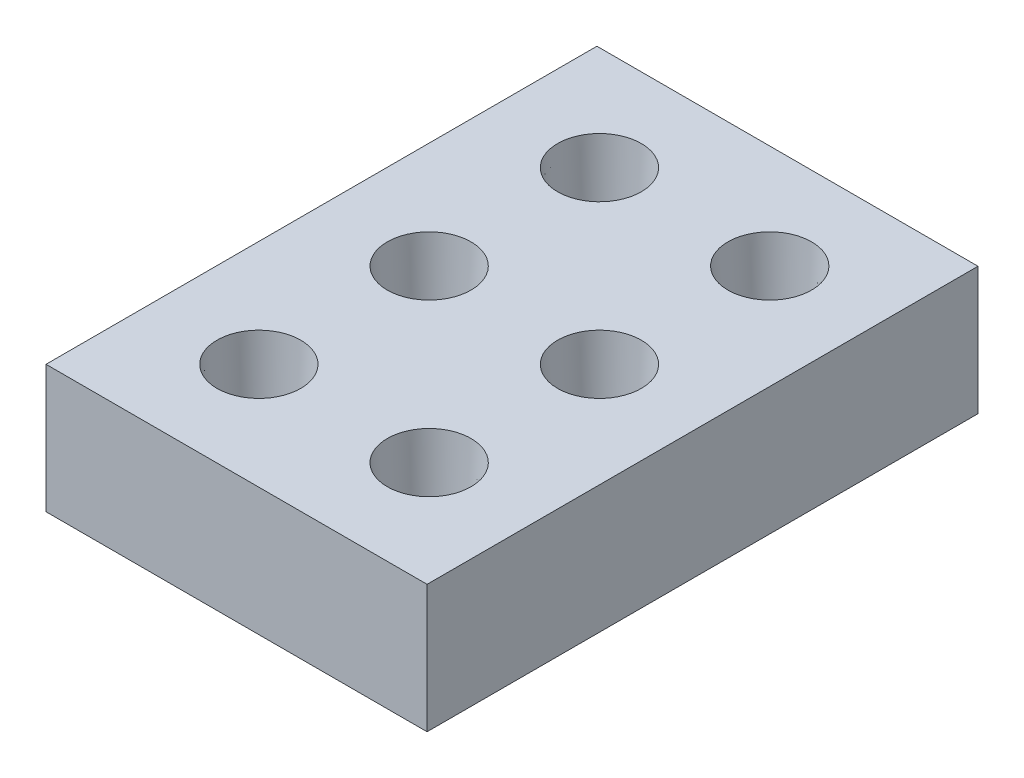
ISO-10303-21;
HEADER;
FILE_DESCRIPTION(('STEP AP214'),'2;1');
FILE_NAME('part.step','',(''),(''),'','','');
FILE_SCHEMA(('AUTOMOTIVE_DESIGN { 1 0 10303 214 1 1 1 1 }'));
ENDSEC;
DATA;
#1=APPLICATION_CONTEXT('core data for automotive mechanical design processes');
#2=APPLICATION_PROTOCOL_DEFINITION('international standard','automotive_design',2000,#1);
#3=PRODUCT_CONTEXT('',#1,'mechanical');
#4=PRODUCT('Part','Part','',(#3));
#5=PRODUCT_RELATED_PRODUCT_CATEGORY('part','',(#4));
#6=PRODUCT_DEFINITION_FORMATION('','',#4);
#7=PRODUCT_DEFINITION_CONTEXT('part definition',#1,'design');
#8=PRODUCT_DEFINITION('design','',#6,#7);
#9=PRODUCT_DEFINITION_SHAPE('','',#8);
#10=(LENGTH_UNIT() NAMED_UNIT(*) SI_UNIT(.MILLI.,.METRE.));
#11=(NAMED_UNIT(*) PLANE_ANGLE_UNIT() SI_UNIT($,.RADIAN.));
#12=(NAMED_UNIT(*) SI_UNIT($,.STERADIAN.) SOLID_ANGLE_UNIT());
#13=UNCERTAINTY_MEASURE_WITH_UNIT(LENGTH_MEASURE(1.E-05),#10,'distance_accuracy_value','');
#14=(GEOMETRIC_REPRESENTATION_CONTEXT(3) GLOBAL_UNCERTAINTY_ASSIGNED_CONTEXT((#13)) GLOBAL_UNIT_ASSIGNED_CONTEXT((#10,
#11,#12)) REPRESENTATION_CONTEXT('',''));
#15=CARTESIAN_POINT('',(0.,0.,0.));
#16=DIRECTION('',(0.,0.,1.));
#17=DIRECTION('',(1.,0.,0.));
#18=AXIS2_PLACEMENT_3D('',#15,#16,#17);
#19=CARTESIAN_POINT('',(-5.,6.,0.));
#20=DIRECTION('',(1.,0.,0.));
#21=DIRECTION('',(0.,0.,-1.));
#22=AXIS2_PLACEMENT_3D('',#19,#20,#21);
#23=PLANE('',#22);
#24=DIRECTION('',(0.,0.,1.));
#25=VECTOR('',#24,1.);
#26=CARTESIAN_POINT('',(-5.,0.,0.));
#27=LINE('',#26,#25);
#28=CARTESIAN_POINT('',(-5.,0.,-25.8806045787026));
#29=VERTEX_POINT('',#28);
#30=CARTESIAN_POINT('',(-5.,0.,0.));
#31=VERTEX_POINT('',#30);
#32=EDGE_CURVE('E107',#29,#31,#27,.T.);
#33=ORIENTED_EDGE('',*,*,#32,.T.);
#34=DIRECTION('',(0.,-1.,0.));
#35=VECTOR('',#34,1.);
#36=CARTESIAN_POINT('',(-5.,6.,0.));
#37=LINE('',#36,#35);
#38=CARTESIAN_POINT('',(-5.,6.,0.));
#39=VERTEX_POINT('',#38);
#40=EDGE_CURVE('E11',#39,#31,#37,.T.);
#41=ORIENTED_EDGE('',*,*,#40,.F.);
#42=DIRECTION('',(0.,0.,1.));
#43=VECTOR('',#42,1.);
#44=CARTESIAN_POINT('',(-5.,6.,0.));
#45=LINE('',#44,#43);
#46=CARTESIAN_POINT('',(-5.,6.,-25.8806045787026));
#47=VERTEX_POINT('',#46);
#48=EDGE_CURVE('E91',#47,#39,#45,.T.);
#49=ORIENTED_EDGE('',*,*,#48,.F.);
#50=DIRECTION('',(0.,-1.,0.));
#51=VECTOR('',#50,1.);
#52=CARTESIAN_POINT('',(-5.,6.,-25.8806045787026));
#53=LINE('',#52,#51);
#54=EDGE_CURVE('E103',#47,#29,#53,.T.);
#55=ORIENTED_EDGE('',*,*,#54,.T.);
#56=EDGE_LOOP('',(#33,#41,#49,#55));
#57=FACE_BOUND('',#56,.T.);
#58=ADVANCED_FACE('F39',(#57),#23,.F.);
#59=CARTESIAN_POINT('',(-5.,6.,0.));
#60=DIRECTION('',(0.,0.,-1.));
#61=DIRECTION('',(-1.,0.,0.));
#62=AXIS2_PLACEMENT_3D('',#59,#60,#61);
#63=PLANE('',#62);
#64=DIRECTION('',(1.,0.,0.));
#65=VECTOR('',#64,1.);
#66=CARTESIAN_POINT('',(-5.,0.,0.));
#67=LINE('',#66,#65);
#68=CARTESIAN_POINT('',(12.90242071817,0.,0.));
#69=VERTEX_POINT('',#68);
#70=EDGE_CURVE('E96',#31,#69,#67,.T.);
#71=ORIENTED_EDGE('',*,*,#70,.T.);
#72=DIRECTION('',(0.,-1.,0.));
#73=VECTOR('',#72,1.);
#74=CARTESIAN_POINT('',(12.90242071817,6.,0.));
#75=LINE('',#74,#73);
#76=CARTESIAN_POINT('',(12.90242071817,6.,0.));
#77=VERTEX_POINT('',#76);
#78=EDGE_CURVE('E48',#77,#69,#75,.T.);
#79=ORIENTED_EDGE('',*,*,#78,.F.);
#80=DIRECTION('',(1.,0.,0.));
#81=VECTOR('',#80,1.);
#82=CARTESIAN_POINT('',(-5.,6.,0.));
#83=LINE('',#82,#81);
#84=EDGE_CURVE('E86',#39,#77,#83,.T.);
#85=ORIENTED_EDGE('',*,*,#84,.F.);
#86=ORIENTED_EDGE('',*,*,#40,.T.);
#87=EDGE_LOOP('',(#71,#79,#85,#86));
#88=FACE_BOUND('',#87,.T.);
#89=ADVANCED_FACE('F95',(#88),#63,.F.);
#90=CARTESIAN_POINT('',(12.90242071817,6.,0.));
#91=DIRECTION('',(-1.,0.,0.));
#92=DIRECTION('',(0.,0.,1.));
#93=AXIS2_PLACEMENT_3D('',#90,#91,#92);
#94=PLANE('',#93);
#95=DIRECTION('',(0.,0.,-1.));
#96=VECTOR('',#95,1.);
#97=CARTESIAN_POINT('',(12.90242071817,0.,0.));
#98=LINE('',#97,#96);
#99=CARTESIAN_POINT('',(12.90242071817,0.,-25.8806045787026));
#100=VERTEX_POINT('',#99);
#101=EDGE_CURVE('E73',#69,#100,#98,.T.);
#102=ORIENTED_EDGE('',*,*,#101,.T.);
#103=DIRECTION('',(0.,-1.,0.));
#104=VECTOR('',#103,1.);
#105=CARTESIAN_POINT('',(12.90242071817,6.,-25.8806045787026));
#106=LINE('',#105,#104);
#107=CARTESIAN_POINT('',(12.90242071817,6.,-25.8806045787026));
#108=VERTEX_POINT('',#107);
#109=EDGE_CURVE('E98',#108,#100,#106,.T.);
#110=ORIENTED_EDGE('',*,*,#109,.F.);
#111=DIRECTION('',(0.,0.,-1.));
#112=VECTOR('',#111,1.);
#113=CARTESIAN_POINT('',(12.90242071817,6.,0.));
#114=LINE('',#113,#112);
#115=EDGE_CURVE('E89',#77,#108,#114,.T.);
#116=ORIENTED_EDGE('',*,*,#115,.F.);
#117=ORIENTED_EDGE('',*,*,#78,.T.);
#118=EDGE_LOOP('',(#102,#110,#116,#117));
#119=FACE_BOUND('',#118,.T.);
#120=ADVANCED_FACE('F99',(#119),#94,.F.);
#121=CARTESIAN_POINT('',(-5.,6.,-25.8806045787026));
#122=DIRECTION('',(0.,0.,1.));
#123=DIRECTION('',(1.,0.,0.));
#124=AXIS2_PLACEMENT_3D('',#121,#122,#123);
#125=PLANE('',#124);
#126=DIRECTION('',(-1.,0.,0.));
#127=VECTOR('',#126,1.);
#128=CARTESIAN_POINT('',(-5.,0.,-25.8806045787026));
#129=LINE('',#128,#127);
#130=EDGE_CURVE('E79',#100,#29,#129,.T.);
#131=ORIENTED_EDGE('',*,*,#130,.T.);
#132=ORIENTED_EDGE('',*,*,#54,.F.);
#133=DIRECTION('',(-1.,0.,0.));
#134=VECTOR('',#133,1.);
#135=CARTESIAN_POINT('',(-5.,6.,-25.8806045787026));
#136=LINE('',#135,#134);
#137=EDGE_CURVE('E56',#108,#47,#136,.T.);
#138=ORIENTED_EDGE('',*,*,#137,.F.);
#139=ORIENTED_EDGE('',*,*,#109,.T.);
#140=EDGE_LOOP('',(#131,#132,#138,#139));
#141=FACE_BOUND('',#140,.T.);
#142=ADVANCED_FACE('F121',(#141),#125,.F.);
#143=CARTESIAN_POINT('',(0.,6.,0.));
#144=DIRECTION('',(0.,-1.,0.));
#145=DIRECTION('',(0.,0.,-1.));
#146=AXIS2_PLACEMENT_3D('',#143,#144,#145);
#147=PLANE('',#146);
#148=CARTESIAN_POINT('',(8.,6.,-21.));
#149=DIRECTION('',(0.,1.,0.));
#150=DIRECTION('',(0.,0.,1.));
#151=AXIS2_PLACEMENT_3D('',#148,#149,#150);
#152=CIRCLE('',#151,1.96579507344183);
#153=CARTESIAN_POINT('',(8.,6.,-19.0342049265582));
#154=VERTEX_POINT('',#153);
#155=EDGE_CURVE('E195',#154,#154,#152,.T.);
#156=ORIENTED_EDGE('',*,*,#155,.F.);
#157=EDGE_LOOP('',(#156));
#158=FACE_BOUND('',#157,.T.);
#159=CARTESIAN_POINT('',(0.,6.,-21.));
#160=DIRECTION('',(0.,1.,0.));
#161=DIRECTION('',(0.,0.,1.));
#162=AXIS2_PLACEMENT_3D('',#159,#160,#161);
#163=CIRCLE('',#162,1.96579507344183);
#164=CARTESIAN_POINT('',(0.,6.,-19.0342049265582));
#165=VERTEX_POINT('',#164);
#166=EDGE_CURVE('E183',#165,#165,#163,.T.);
#167=ORIENTED_EDGE('',*,*,#166,.F.);
#168=EDGE_LOOP('',(#167));
#169=FACE_BOUND('',#168,.T.);
#170=CARTESIAN_POINT('',(8.,6.,-13.));
#171=DIRECTION('',(0.,1.,0.));
#172=DIRECTION('',(0.,0.,1.));
#173=AXIS2_PLACEMENT_3D('',#170,#171,#172);
#174=CIRCLE('',#173,1.96579507344183);
#175=CARTESIAN_POINT('',(8.,6.,-11.0342049265582));
#176=VERTEX_POINT('',#175);
#177=EDGE_CURVE('E171',#176,#176,#174,.T.);
#178=ORIENTED_EDGE('',*,*,#177,.F.);
#179=EDGE_LOOP('',(#178));
#180=FACE_BOUND('',#179,.T.);
#181=CARTESIAN_POINT('',(0.,6.,-13.));
#182=DIRECTION('',(0.,1.,0.));
#183=DIRECTION('',(0.,0.,1.));
#184=AXIS2_PLACEMENT_3D('',#181,#182,#183);
#185=CIRCLE('',#184,1.96579507344183);
#186=CARTESIAN_POINT('',(0.,6.,-11.0342049265582));
#187=VERTEX_POINT('',#186);
#188=EDGE_CURVE('E159',#187,#187,#185,.T.);
#189=ORIENTED_EDGE('',*,*,#188,.F.);
#190=EDGE_LOOP('',(#189));
#191=FACE_BOUND('',#190,.T.);
#192=CARTESIAN_POINT('',(8.,6.,-5.));
#193=DIRECTION('',(0.,1.,0.));
#194=DIRECTION('',(0.,0.,1.));
#195=AXIS2_PLACEMENT_3D('',#192,#193,#194);
#196=CIRCLE('',#195,1.96579507344183);
#197=CARTESIAN_POINT('',(8.,6.,-3.03420492655817));
#198=VERTEX_POINT('',#197);
#199=EDGE_CURVE('E147',#198,#198,#196,.T.);
#200=ORIENTED_EDGE('',*,*,#199,.F.);
#201=EDGE_LOOP('',(#200));
#202=FACE_BOUND('',#201,.T.);
#203=CARTESIAN_POINT('',(0.,6.,-5.));
#204=DIRECTION('',(0.,1.,0.));
#205=DIRECTION('',(0.,0.,1.));
#206=AXIS2_PLACEMENT_3D('',#203,#204,#205);
#207=CIRCLE('',#206,1.96579507344183);
#208=CARTESIAN_POINT('',(0.,6.,-3.03420492655817));
#209=VERTEX_POINT('',#208);
#210=EDGE_CURVE('E135',#209,#209,#207,.T.);
#211=ORIENTED_EDGE('',*,*,#210,.F.);
#212=EDGE_LOOP('',(#211));
#213=FACE_BOUND('',#212,.T.);
#214=ORIENTED_EDGE('',*,*,#48,.T.);
#215=ORIENTED_EDGE('',*,*,#84,.T.);
#216=ORIENTED_EDGE('',*,*,#115,.T.);
#217=ORIENTED_EDGE('',*,*,#137,.T.);
#218=EDGE_LOOP('',(#214,#215,#216,#217));
#219=FACE_BOUND('',#218,.T.);
#220=ADVANCED_FACE('F87',(#158,#169,#180,#191,#202,#213,#219),#147,.F.);
#221=CARTESIAN_POINT('',(0.,0.,0.));
#222=DIRECTION('',(0.,-1.,0.));
#223=DIRECTION('',(0.,0.,-1.));
#224=AXIS2_PLACEMENT_3D('',#221,#222,#223);
#225=PLANE('',#224);
#226=CARTESIAN_POINT('',(8.,0.,-21.));
#227=DIRECTION('',(0.,1.,0.));
#228=DIRECTION('',(0.,0.,1.));
#229=AXIS2_PLACEMENT_3D('',#226,#227,#228);
#230=CIRCLE('',#229,1.77);
#231=CARTESIAN_POINT('',(8.,0.,-19.23));
#232=VERTEX_POINT('',#231);
#233=EDGE_CURVE('E187',#232,#232,#230,.T.);
#234=ORIENTED_EDGE('',*,*,#233,.T.);
#235=EDGE_LOOP('',(#234));
#236=FACE_BOUND('',#235,.T.);
#237=CARTESIAN_POINT('',(0.,0.,-21.));
#238=DIRECTION('',(0.,1.,0.));
#239=DIRECTION('',(0.,0.,1.));
#240=AXIS2_PLACEMENT_3D('',#237,#238,#239);
#241=CIRCLE('',#240,1.77);
#242=CARTESIAN_POINT('',(0.,0.,-19.23));
#243=VERTEX_POINT('',#242);
#244=EDGE_CURVE('E175',#243,#243,#241,.T.);
#245=ORIENTED_EDGE('',*,*,#244,.T.);
#246=EDGE_LOOP('',(#245));
#247=FACE_BOUND('',#246,.T.);
#248=CARTESIAN_POINT('',(8.,0.,-13.));
#249=DIRECTION('',(0.,1.,0.));
#250=DIRECTION('',(0.,0.,1.));
#251=AXIS2_PLACEMENT_3D('',#248,#249,#250);
#252=CIRCLE('',#251,1.77);
#253=CARTESIAN_POINT('',(8.,0.,-11.23));
#254=VERTEX_POINT('',#253);
#255=EDGE_CURVE('E163',#254,#254,#252,.T.);
#256=ORIENTED_EDGE('',*,*,#255,.T.);
#257=EDGE_LOOP('',(#256));
#258=FACE_BOUND('',#257,.T.);
#259=CARTESIAN_POINT('',(0.,0.,-13.));
#260=DIRECTION('',(0.,1.,0.));
#261=DIRECTION('',(0.,0.,1.));
#262=AXIS2_PLACEMENT_3D('',#259,#260,#261);
#263=CIRCLE('',#262,1.77);
#264=CARTESIAN_POINT('',(0.,0.,-11.23));
#265=VERTEX_POINT('',#264);
#266=EDGE_CURVE('E151',#265,#265,#263,.T.);
#267=ORIENTED_EDGE('',*,*,#266,.T.);
#268=EDGE_LOOP('',(#267));
#269=FACE_BOUND('',#268,.T.);
#270=CARTESIAN_POINT('',(8.,0.,-5.));
#271=DIRECTION('',(0.,1.,0.));
#272=DIRECTION('',(0.,0.,1.));
#273=AXIS2_PLACEMENT_3D('',#270,#271,#272);
#274=CIRCLE('',#273,1.77);
#275=CARTESIAN_POINT('',(8.,0.,-3.23));
#276=VERTEX_POINT('',#275);
#277=EDGE_CURVE('E139',#276,#276,#274,.T.);
#278=ORIENTED_EDGE('',*,*,#277,.T.);
#279=EDGE_LOOP('',(#278));
#280=FACE_BOUND('',#279,.T.);
#281=CARTESIAN_POINT('',(0.,0.,-5.));
#282=DIRECTION('',(0.,1.,0.));
#283=DIRECTION('',(0.,0.,1.));
#284=AXIS2_PLACEMENT_3D('',#281,#282,#283);
#285=CIRCLE('',#284,1.77);
#286=CARTESIAN_POINT('',(0.,0.,-3.23));
#287=VERTEX_POINT('',#286);
#288=EDGE_CURVE('E111',#287,#287,#285,.T.);
#289=ORIENTED_EDGE('',*,*,#288,.T.);
#290=EDGE_LOOP('',(#289));
#291=FACE_BOUND('',#290,.T.);
#292=ORIENTED_EDGE('',*,*,#32,.F.);
#293=ORIENTED_EDGE('',*,*,#130,.F.);
#294=ORIENTED_EDGE('',*,*,#101,.F.);
#295=ORIENTED_EDGE('',*,*,#70,.F.);
#296=EDGE_LOOP('',(#292,#293,#294,#295));
#297=FACE_BOUND('',#296,.T.);
#298=ADVANCED_FACE('F124',(#236,#247,#258,#269,#280,#291,#297),#225,.T.);
#299=CARTESIAN_POINT('',(0.,6.,-5.));
#300=DIRECTION('',(0.,1.,0.));
#301=DIRECTION('',(0.,0.,1.));
#302=AXIS2_PLACEMENT_3D('',#299,#300,#301);
#303=CYLINDRICAL_SURFACE('',#302,1.77);
#304=ORIENTED_EDGE('',*,*,#288,.F.);
#305=EDGE_LOOP('',(#304));
#306=FACE_BOUND('',#305,.T.);
#307=CARTESIAN_POINT('',(0.,3.2,-5.));
#308=DIRECTION('',(0.,1.,0.));
#309=DIRECTION('',(0.,0.,1.));
#310=AXIS2_PLACEMENT_3D('',#307,#308,#309);
#311=CIRCLE('',#310,1.77);
#312=CARTESIAN_POINT('',(0.,3.2,-3.23));
#313=VERTEX_POINT('',#312);
#314=EDGE_CURVE('E131',#313,#313,#311,.T.);
#315=ORIENTED_EDGE('',*,*,#314,.T.);
#316=EDGE_LOOP('',(#315));
#317=FACE_BOUND('',#316,.T.);
#318=ADVANCED_FACE('F218',(#306,#317),#303,.F.);
#319=CARTESIAN_POINT('',(0.,6.,-5.));
#320=DIRECTION('',(0.,1.,0.));
#321=DIRECTION('',(0.,0.,1.));
#322=AXIS2_PLACEMENT_3D('',#319,#320,#321);
#323=CONICAL_SURFACE('',#322,1.96579507344183,0.0698131700797732);
#324=ORIENTED_EDGE('',*,*,#314,.F.);
#325=EDGE_LOOP('',(#324));
#326=FACE_BOUND('',#325,.T.);
#327=ORIENTED_EDGE('',*,*,#210,.T.);
#328=EDGE_LOOP('',(#327));
#329=FACE_BOUND('',#328,.T.);
#330=ADVANCED_FACE('F215',(#326,#329),#323,.F.);
#331=CARTESIAN_POINT('',(8.,6.,-5.));
#332=DIRECTION('',(0.,1.,0.));
#333=DIRECTION('',(0.,0.,1.));
#334=AXIS2_PLACEMENT_3D('',#331,#332,#333);
#335=CYLINDRICAL_SURFACE('',#334,1.77);
#336=ORIENTED_EDGE('',*,*,#277,.F.);
#337=EDGE_LOOP('',(#336));
#338=FACE_BOUND('',#337,.T.);
#339=CARTESIAN_POINT('',(8.,3.2,-5.));
#340=DIRECTION('',(0.,1.,0.));
#341=DIRECTION('',(0.,0.,1.));
#342=AXIS2_PLACEMENT_3D('',#339,#340,#341);
#343=CIRCLE('',#342,1.77);
#344=CARTESIAN_POINT('',(8.,3.2,-3.23));
#345=VERTEX_POINT('',#344);
#346=EDGE_CURVE('E143',#345,#345,#343,.T.);
#347=ORIENTED_EDGE('',*,*,#346,.T.);
#348=EDGE_LOOP('',(#347));
#349=FACE_BOUND('',#348,.T.);
#350=ADVANCED_FACE('F217',(#338,#349),#335,.F.);
#351=CARTESIAN_POINT('',(8.,6.,-5.));
#352=DIRECTION('',(0.,1.,0.));
#353=DIRECTION('',(0.,0.,1.));
#354=AXIS2_PLACEMENT_3D('',#351,#352,#353);
#355=CONICAL_SURFACE('',#354,1.96579507344183,0.0698131700797732);
#356=ORIENTED_EDGE('',*,*,#346,.F.);
#357=EDGE_LOOP('',(#356));
#358=FACE_BOUND('',#357,.T.);
#359=ORIENTED_EDGE('',*,*,#199,.T.);
#360=EDGE_LOOP('',(#359));
#361=FACE_BOUND('',#360,.T.);
#362=ADVANCED_FACE('F225',(#358,#361),#355,.F.);
#363=CARTESIAN_POINT('',(0.,6.,-13.));
#364=DIRECTION('',(0.,1.,0.));
#365=DIRECTION('',(0.,0.,1.));
#366=AXIS2_PLACEMENT_3D('',#363,#364,#365);
#367=CYLINDRICAL_SURFACE('',#366,1.77);
#368=ORIENTED_EDGE('',*,*,#266,.F.);
#369=EDGE_LOOP('',(#368));
#370=FACE_BOUND('',#369,.T.);
#371=CARTESIAN_POINT('',(0.,3.2,-13.));
#372=DIRECTION('',(0.,1.,0.));
#373=DIRECTION('',(0.,0.,1.));
#374=AXIS2_PLACEMENT_3D('',#371,#372,#373);
#375=CIRCLE('',#374,1.77);
#376=CARTESIAN_POINT('',(0.,3.2,-11.23));
#377=VERTEX_POINT('',#376);
#378=EDGE_CURVE('E155',#377,#377,#375,.T.);
#379=ORIENTED_EDGE('',*,*,#378,.T.);
#380=EDGE_LOOP('',(#379));
#381=FACE_BOUND('',#380,.T.);
#382=ADVANCED_FACE('F263',(#370,#381),#367,.F.);
#383=CARTESIAN_POINT('',(0.,6.,-13.));
#384=DIRECTION('',(0.,1.,0.));
#385=DIRECTION('',(0.,0.,1.));
#386=AXIS2_PLACEMENT_3D('',#383,#384,#385);
#387=CONICAL_SURFACE('',#386,1.96579507344183,0.0698131700797732);
#388=ORIENTED_EDGE('',*,*,#378,.F.);
#389=EDGE_LOOP('',(#388));
#390=FACE_BOUND('',#389,.T.);
#391=ORIENTED_EDGE('',*,*,#188,.T.);
#392=EDGE_LOOP('',(#391));
#393=FACE_BOUND('',#392,.T.);
#394=ADVANCED_FACE('F268',(#390,#393),#387,.F.);
#395=CARTESIAN_POINT('',(8.,6.,-13.));
#396=DIRECTION('',(0.,1.,0.));
#397=DIRECTION('',(0.,0.,1.));
#398=AXIS2_PLACEMENT_3D('',#395,#396,#397);
#399=CYLINDRICAL_SURFACE('',#398,1.77);
#400=ORIENTED_EDGE('',*,*,#255,.F.);
#401=EDGE_LOOP('',(#400));
#402=FACE_BOUND('',#401,.T.);
#403=CARTESIAN_POINT('',(8.,3.2,-13.));
#404=DIRECTION('',(0.,1.,0.));
#405=DIRECTION('',(0.,0.,1.));
#406=AXIS2_PLACEMENT_3D('',#403,#404,#405);
#407=CIRCLE('',#406,1.77);
#408=CARTESIAN_POINT('',(8.,3.2,-11.23));
#409=VERTEX_POINT('',#408);
#410=EDGE_CURVE('E167',#409,#409,#407,.T.);
#411=ORIENTED_EDGE('',*,*,#410,.T.);
#412=EDGE_LOOP('',(#411));
#413=FACE_BOUND('',#412,.T.);
#414=ADVANCED_FACE('F274',(#402,#413),#399,.F.);
#415=CARTESIAN_POINT('',(8.,6.,-13.));
#416=DIRECTION('',(0.,1.,0.));
#417=DIRECTION('',(0.,0.,1.));
#418=AXIS2_PLACEMENT_3D('',#415,#416,#417);
#419=CONICAL_SURFACE('',#418,1.96579507344183,0.0698131700797732);
#420=ORIENTED_EDGE('',*,*,#410,.F.);
#421=EDGE_LOOP('',(#420));
#422=FACE_BOUND('',#421,.T.);
#423=ORIENTED_EDGE('',*,*,#177,.T.);
#424=EDGE_LOOP('',(#423));
#425=FACE_BOUND('',#424,.T.);
#426=ADVANCED_FACE('F278',(#422,#425),#419,.F.);
#427=CARTESIAN_POINT('',(0.,6.,-21.));
#428=DIRECTION('',(0.,1.,0.));
#429=DIRECTION('',(0.,0.,1.));
#430=AXIS2_PLACEMENT_3D('',#427,#428,#429);
#431=CYLINDRICAL_SURFACE('',#430,1.77);
#432=ORIENTED_EDGE('',*,*,#244,.F.);
#433=EDGE_LOOP('',(#432));
#434=FACE_BOUND('',#433,.T.);
#435=CARTESIAN_POINT('',(0.,3.2,-21.));
#436=DIRECTION('',(0.,1.,0.));
#437=DIRECTION('',(0.,0.,1.));
#438=AXIS2_PLACEMENT_3D('',#435,#436,#437);
#439=CIRCLE('',#438,1.77);
#440=CARTESIAN_POINT('',(0.,3.2,-19.23));
#441=VERTEX_POINT('',#440);
#442=EDGE_CURVE('E179',#441,#441,#439,.T.);
#443=ORIENTED_EDGE('',*,*,#442,.T.);
#444=EDGE_LOOP('',(#443));
#445=FACE_BOUND('',#444,.T.);
#446=ADVANCED_FACE('F282',(#434,#445),#431,.F.);
#447=CARTESIAN_POINT('',(0.,6.,-21.));
#448=DIRECTION('',(0.,1.,0.));
#449=DIRECTION('',(0.,0.,1.));
#450=AXIS2_PLACEMENT_3D('',#447,#448,#449);
#451=CONICAL_SURFACE('',#450,1.96579507344183,0.0698131700797732);
#452=ORIENTED_EDGE('',*,*,#442,.F.);
#453=EDGE_LOOP('',(#452));
#454=FACE_BOUND('',#453,.T.);
#455=ORIENTED_EDGE('',*,*,#166,.T.);
#456=EDGE_LOOP('',(#455));
#457=FACE_BOUND('',#456,.T.);
#458=ADVANCED_FACE('F286',(#454,#457),#451,.F.);
#459=CARTESIAN_POINT('',(8.,6.,-21.));
#460=DIRECTION('',(0.,1.,0.));
#461=DIRECTION('',(0.,0.,1.));
#462=AXIS2_PLACEMENT_3D('',#459,#460,#461);
#463=CYLINDRICAL_SURFACE('',#462,1.77);
#464=ORIENTED_EDGE('',*,*,#233,.F.);
#465=EDGE_LOOP('',(#464));
#466=FACE_BOUND('',#465,.T.);
#467=CARTESIAN_POINT('',(8.,3.2,-21.));
#468=DIRECTION('',(0.,1.,0.));
#469=DIRECTION('',(0.,0.,1.));
#470=AXIS2_PLACEMENT_3D('',#467,#468,#469);
#471=CIRCLE('',#470,1.77);
#472=CARTESIAN_POINT('',(8.,3.2,-19.23));
#473=VERTEX_POINT('',#472);
#474=EDGE_CURVE('E191',#473,#473,#471,.T.);
#475=ORIENTED_EDGE('',*,*,#474,.T.);
#476=EDGE_LOOP('',(#475));
#477=FACE_BOUND('',#476,.T.);
#478=ADVANCED_FACE('F290',(#466,#477),#463,.F.);
#479=CARTESIAN_POINT('',(8.,6.,-21.));
#480=DIRECTION('',(0.,1.,0.));
#481=DIRECTION('',(0.,0.,1.));
#482=AXIS2_PLACEMENT_3D('',#479,#480,#481);
#483=CONICAL_SURFACE('',#482,1.96579507344183,0.0698131700797732);
#484=ORIENTED_EDGE('',*,*,#474,.F.);
#485=EDGE_LOOP('',(#484));
#486=FACE_BOUND('',#485,.T.);
#487=ORIENTED_EDGE('',*,*,#155,.T.);
#488=EDGE_LOOP('',(#487));
#489=FACE_BOUND('',#488,.T.);
#490=ADVANCED_FACE('F200',(#486,#489),#483,.F.);
#491=CLOSED_SHELL('',(#58,#89,#120,#142,#220,#298,#318,#330,#350,#362,#382,#394,#414,#426,#446,
#458,#478,#490));
#492=MANIFOLD_SOLID_BREP('B2',#491);
#493=ADVANCED_BREP_SHAPE_REPRESENTATION('',(#18,#492),#14);
#494=SHAPE_DEFINITION_REPRESENTATION(#9,#493);
ENDSEC;
END-ISO-10303-21;
